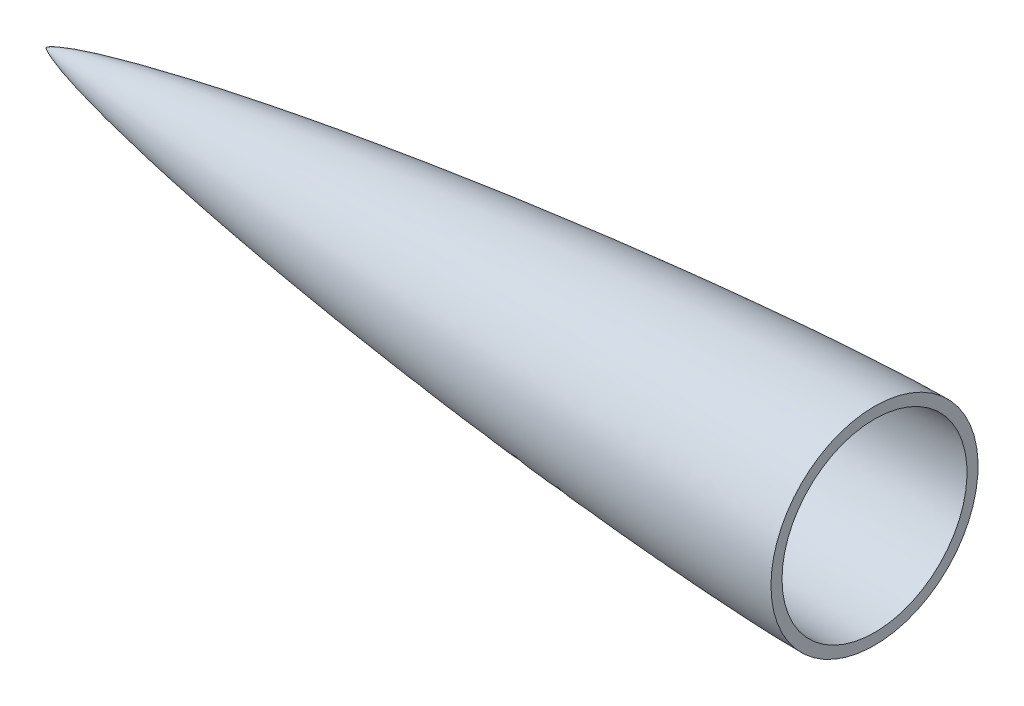
ISO-10303-21;
HEADER;
FILE_DESCRIPTION(('STEP AP214'),'2;1');
FILE_NAME('part.step','',(''),(''),'','','');
FILE_SCHEMA(('AUTOMOTIVE_DESIGN { 1 0 10303 214 1 1 1 1 }'));
ENDSEC;
DATA;
#1=APPLICATION_CONTEXT('core data for automotive mechanical design processes');
#2=APPLICATION_PROTOCOL_DEFINITION('international standard','automotive_design',2000,#1);
#3=PRODUCT_CONTEXT('',#1,'mechanical');
#4=PRODUCT('Part','Part','',(#3));
#5=PRODUCT_RELATED_PRODUCT_CATEGORY('part','',(#4));
#6=PRODUCT_DEFINITION_FORMATION('','',#4);
#7=PRODUCT_DEFINITION_CONTEXT('part definition',#1,'design');
#8=PRODUCT_DEFINITION('design','',#6,#7);
#9=PRODUCT_DEFINITION_SHAPE('','',#8);
#10=(LENGTH_UNIT() NAMED_UNIT(*) SI_UNIT(.MILLI.,.METRE.));
#11=(NAMED_UNIT(*) PLANE_ANGLE_UNIT() SI_UNIT($,.RADIAN.));
#12=(NAMED_UNIT(*) SI_UNIT($,.STERADIAN.) SOLID_ANGLE_UNIT());
#13=UNCERTAINTY_MEASURE_WITH_UNIT(LENGTH_MEASURE(1.E-05),#10,'distance_accuracy_value','');
#14=(GEOMETRIC_REPRESENTATION_CONTEXT(3) GLOBAL_UNCERTAINTY_ASSIGNED_CONTEXT((#13)) GLOBAL_UNIT_ASSIGNED_CONTEXT((#10,
#11,#12)) REPRESENTATION_CONTEXT('',''));
#15=CARTESIAN_POINT('',(0.,0.,0.));
#16=DIRECTION('',(0.,0.,1.));
#17=DIRECTION('',(1.,0.,0.));
#18=AXIS2_PLACEMENT_3D('',#15,#16,#17);
#19=CARTESIAN_POINT('',(300.,37.5,0.));
#20=CARTESIAN_POINT('',(299.053924011818,37.4971739403759,0.));
#21=CARTESIAN_POINT('',(297.161873744708,37.4748411293635,0.));
#22=CARTESIAN_POINT('',(293.378169918809,37.4058641006294,0.));
#23=CARTESIAN_POINT('',(284.902330546139,37.1715530458375,0.));
#24=CARTESIAN_POINT('',(272.684228342787,36.682095727306,0.));
#25=CARTESIAN_POINT('',(256.729777817299,35.8426847412045,0.));
#26=CARTESIAN_POINT('',(237.990103526241,34.629024109173,0.));
#27=CARTESIAN_POINT('',(219.264008612003,33.2226523904283,0.));
#28=CARTESIAN_POINT('',(200.551861462531,31.6417996554157,0.));
#29=CARTESIAN_POINT('',(181.854350055617,29.896724752738,0.));
#30=CARTESIAN_POINT('',(163.172446392856,27.991682268909,0.));
#31=CARTESIAN_POINT('',(144.507625807184,25.926105289295,0.));
#32=CARTESIAN_POINT('',(125.861806117259,23.6950271596646,0.));
#33=CARTESIAN_POINT('',(107.23796061422,21.2874599804908,0.));
#34=CARTESIAN_POINT('',(88.6400136580042,18.6862372553811,0.));
#35=CARTESIAN_POINT('',(70.074710105843,15.8612974837844,0.));
#36=CARTESIAN_POINT('',(51.55196809468,12.7664940875388,0.));
#37=CARTESIAN_POINT('',(35.2610152204738,9.71678375401304,0.));
#38=CARTESIAN_POINT('',(22.0320807054232,6.90120490618604,0.));
#39=CARTESIAN_POINT('',(12.583389004723,4.55296660898076,0.));
#40=CARTESIAN_POINT('',(7.26310775238099,3.0256529109482,0.));
#41=CARTESIAN_POINT('',(4.10539008591153,1.9738419476301,0.));
#42=CARTESIAN_POINT('',(2.38278619939278,1.31159831302358,0.));
#43=CARTESIAN_POINT('',(1.43687490091439,0.896846557785503,0.));
#44=CARTESIAN_POINT('',(0.89756851882891,0.629376705197313,0.));
#45=CARTESIAN_POINT('',(0.578613323697114,0.452535984730929,0.));
#46=CARTESIAN_POINT('',(0.387460909030794,0.334827052271903,0.));
#47=CARTESIAN_POINT('',(0.260848460841596,0.248758489198538,0.));
#48=CARTESIAN_POINT('',(0.168313709014921,0.179368917364162,0.));
#49=CARTESIAN_POINT('',(0.104176490222134,0.125968337279301,0.));
#50=CARTESIAN_POINT('',(0.0552424717720667,0.0791570260129427,0.));
#51=CARTESIAN_POINT('',(0.0216728347720757,0.0396364118190024,0.));
#52=CARTESIAN_POINT('',(0.00713207777425987,0.0180474263577413,0.));
#53=CARTESIAN_POINT('',(0.00202957358175542,0.00618700622178298,0.));
#54=CARTESIAN_POINT('',(0.,0.,0.));
#55=B_SPLINE_CURVE_WITH_KNOTS('',4,(#19,#20,#21,#22,#23,#24,#25,#26,#27,#28,#29,#30,#31,#32,#33,
#34,#35,#36,#37,#38,#39,#40,#41,#42,#43,#44,#45,#46,#47,#48,#49,#50,#51,#52,#53,#54),
.UNSPECIFIED.,.F.,.F.,(5,1,1,1,1,1,1,1,1,1,1,1,1,1,1,1,1,1,1,1,1,1,1,1,1,1,1,1,1,1,1,1,5),(0.,
0.0124834695626188,0.0249669391252375,0.049933878250475,0.111879608590109,0.173825337087147,
0.235771067104224,0.297716795626243,0.359662526340917,0.421608254246319,0.483553983342822,
0.545499713482553,0.607445443480169,0.669391171804991,0.731336900866697,0.793282631355366,
0.855228352690804,0.917174087361943,0.950014131685463,0.971718187006424,0.983673349968075,
0.990192351699562,0.993917623808536,0.99606156190609,0.997297176824631,0.998132711635264,
0.998728421520602,0.99902254586944,0.999316670218278,0.999658335109139,0.99982916755457,
0.999914583777285,1.),.UNSPECIFIED.);
#56=CARTESIAN_POINT('',(0.,0.,0.));
#57=DIRECTION('',(-1.,0.,0.));
#58=AXIS1_PLACEMENT('',#56,#57);
#59=SURFACE_OF_REVOLUTION('',#55,#58);
#60=CARTESIAN_POINT('',(0.,0.,0.));
#61=VERTEX_POINT('',#60);
#62=VERTEX_LOOP('',#61);
#63=FACE_BOUND('',#62,.T.);
#64=CARTESIAN_POINT('',(300.,0.,0.));
#65=DIRECTION('',(-1.,0.,0.));
#66=DIRECTION('',(0.,0.,1.));
#67=AXIS2_PLACEMENT_3D('',#64,#65,#66);
#68=CIRCLE('',#67,37.5);
#69=CARTESIAN_POINT('',(300.,0.,37.5));
#70=VERTEX_POINT('',#69);
#71=EDGE_CURVE('E11',#70,#70,#68,.T.);
#72=ORIENTED_EDGE('',*,*,#71,.T.);
#73=EDGE_LOOP('',(#72));
#74=FACE_BOUND('',#73,.T.);
#75=ADVANCED_FACE('F39',(#63,#74),#59,.T.);
#76=CARTESIAN_POINT('',(300.,0.,0.));
#77=DIRECTION('',(-1.,0.,0.));
#78=DIRECTION('',(0.,0.,1.));
#79=AXIS2_PLACEMENT_3D('',#76,#77,#78);
#80=PLANE('',#79);
#81=CARTESIAN_POINT('',(300.,0.,0.));
#82=DIRECTION('',(-1.,0.,0.));
#83=DIRECTION('',(0.,0.,1.));
#84=AXIS2_PLACEMENT_3D('',#81,#82,#83);
#85=CIRCLE('',#84,33.4999816415484);
#86=CARTESIAN_POINT('',(300.,0.,33.4999816415484));
#87=VERTEX_POINT('',#86);
#88=EDGE_CURVE('E47',#87,#87,#85,.T.);
#89=ORIENTED_EDGE('',*,*,#88,.T.);
#90=EDGE_LOOP('',(#89));
#91=FACE_BOUND('',#90,.T.);
#92=ORIENTED_EDGE('',*,*,#71,.F.);
#93=EDGE_LOOP('',(#92));
#94=FACE_BOUND('',#93,.T.);
#95=ADVANCED_FACE('F56',(#91,#94),#80,.F.);
#96=CARTESIAN_POINT('',(300.,37.5,0.));
#97=CARTESIAN_POINT('',(299.053924011818,37.4971739403759,0.));
#98=CARTESIAN_POINT('',(297.161873744708,37.4748411293635,0.));
#99=CARTESIAN_POINT('',(293.378169918809,37.4058641006294,0.));
#100=CARTESIAN_POINT('',(284.902330546139,37.1715530458375,0.));
#101=CARTESIAN_POINT('',(272.684228342787,36.682095727306,0.));
#102=CARTESIAN_POINT('',(256.729777817299,35.8426847412045,0.));
#103=CARTESIAN_POINT('',(237.990103526241,34.629024109173,0.));
#104=CARTESIAN_POINT('',(219.264008612003,33.2226523904283,0.));
#105=CARTESIAN_POINT('',(200.551861462531,31.6417996554157,0.));
#106=CARTESIAN_POINT('',(181.854350055617,29.896724752738,0.));
#107=CARTESIAN_POINT('',(163.172446392856,27.991682268909,0.));
#108=CARTESIAN_POINT('',(144.507625807184,25.926105289295,0.));
#109=CARTESIAN_POINT('',(125.861806117259,23.6950271596646,0.));
#110=CARTESIAN_POINT('',(107.23796061422,21.2874599804908,0.));
#111=CARTESIAN_POINT('',(88.6400136580042,18.6862372553811,0.));
#112=CARTESIAN_POINT('',(70.074710105843,15.8612974837844,0.));
#113=CARTESIAN_POINT('',(51.55196809468,12.7664940875388,0.));
#114=CARTESIAN_POINT('',(35.2610152204738,9.71678375401304,0.));
#115=CARTESIAN_POINT('',(22.6179035144936,7.02588844044319,0.));
#116=CARTESIAN_POINT('',(14.6256838719045,5.05911016812515,0.));
#117=CARTESIAN_POINT('',(11.2138849785522,4.13382901726001,0.));
#118=CARTESIAN_POINT('',(10.2068583356958,3.8508647596265,0.));
#119=B_SPLINE_CURVE_WITH_KNOTS('',4,(#96,#97,#98,#99,#100,#101,#102,#103,#104,#105,#106,#107,
#108,#109,#110,#111,#112,#113,#114,#115,#116,#117,#118),.UNSPECIFIED.,.F.,.F.,(5,1,1,1,1,1,1,1,
1,1,1,1,1,1,1,1,1,1,1,5),(0.,0.0124834695626188,0.0249669391252375,0.049933878250475,
0.111879608590109,0.173825337087147,0.235771067104224,0.297716795626243,0.359662526340917,
0.421608254246319,0.483553983342822,0.545499713482553,0.607445443480169,0.669391171804991,
0.731336900866697,0.793282631355366,0.855228352690804,0.917174087361943,0.950014131685463,
0.963816445688512),.UNSPECIFIED.);
#120=CARTESIAN_POINT('',(0.,0.,0.));
#121=DIRECTION('',(-1.,0.,0.));
#122=AXIS1_PLACEMENT('',#120,#121);
#123=SURFACE_OF_REVOLUTION('',#119,#122);
#124=OFFSET_SURFACE('',#123,-4.,.F.);
#125=CARTESIAN_POINT('',(11.2889122174719,0.,0.));
#126=VERTEX_POINT('',#125);
#127=VERTEX_LOOP('',#126);
#128=FACE_BOUND('',#127,.T.);
#129=ORIENTED_EDGE('',*,*,#88,.F.);
#130=EDGE_LOOP('',(#129));
#131=FACE_BOUND('',#130,.T.);
#132=ADVANCED_FACE('F53',(#128,#131),#124,.F.);
#133=CLOSED_SHELL('',(#75,#95,#132));
#134=MANIFOLD_SOLID_BREP('B2',#133);
#135=ADVANCED_BREP_SHAPE_REPRESENTATION('',(#18,#134),#14);
#136=SHAPE_DEFINITION_REPRESENTATION(#9,#135);
ENDSEC;
END-ISO-10303-21;
